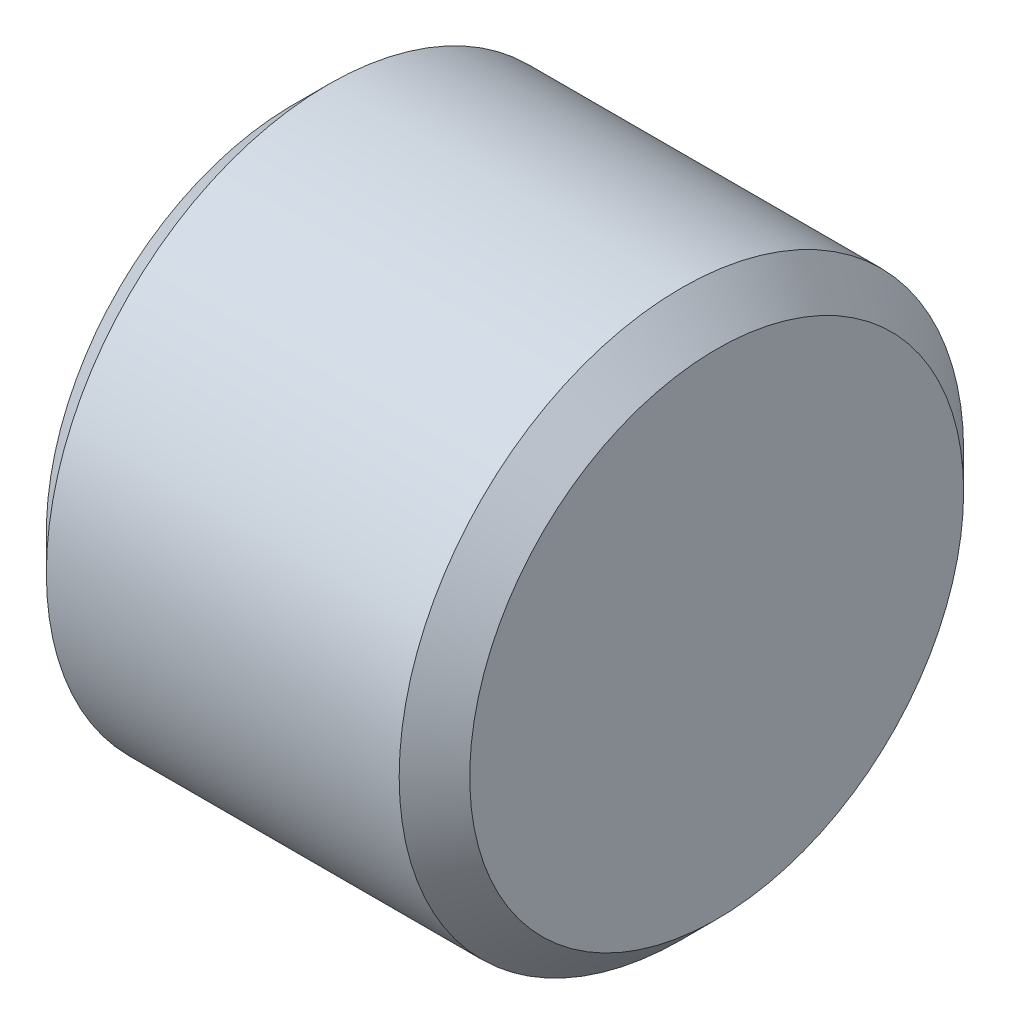
ISO-10303-21;
HEADER;
FILE_DESCRIPTION(('STEP AP214'),'2;1');
FILE_NAME('part.step','',(''),(''),'','','');
FILE_SCHEMA(('AUTOMOTIVE_DESIGN { 1 0 10303 214 1 1 1 1 }'));
ENDSEC;
DATA;
#1=APPLICATION_CONTEXT('core data for automotive mechanical design processes');
#2=APPLICATION_PROTOCOL_DEFINITION('international standard','automotive_design',2000,#1);
#3=PRODUCT_CONTEXT('',#1,'mechanical');
#4=PRODUCT('Part','Part','',(#3));
#5=PRODUCT_RELATED_PRODUCT_CATEGORY('part','',(#4));
#6=PRODUCT_DEFINITION_FORMATION('','',#4);
#7=PRODUCT_DEFINITION_CONTEXT('part definition',#1,'design');
#8=PRODUCT_DEFINITION('design','',#6,#7);
#9=PRODUCT_DEFINITION_SHAPE('','',#8);
#10=(LENGTH_UNIT() NAMED_UNIT(*) SI_UNIT(.MILLI.,.METRE.));
#11=(NAMED_UNIT(*) PLANE_ANGLE_UNIT() SI_UNIT($,.RADIAN.));
#12=(NAMED_UNIT(*) SI_UNIT($,.STERADIAN.) SOLID_ANGLE_UNIT());
#13=UNCERTAINTY_MEASURE_WITH_UNIT(LENGTH_MEASURE(1.E-05),#10,'distance_accuracy_value','');
#14=(GEOMETRIC_REPRESENTATION_CONTEXT(3) GLOBAL_UNCERTAINTY_ASSIGNED_CONTEXT((#13)) GLOBAL_UNIT_ASSIGNED_CONTEXT((#10,
#11,#12)) REPRESENTATION_CONTEXT('',''));
#15=CARTESIAN_POINT('',(0.,0.,0.));
#16=DIRECTION('',(0.,0.,1.));
#17=DIRECTION('',(1.,0.,0.));
#18=AXIS2_PLACEMENT_3D('',#15,#16,#17);
#19=CARTESIAN_POINT('',(6.,0.,0.));
#20=DIRECTION('',(-1.,0.,0.));
#21=DIRECTION('',(0.,0.,1.));
#22=AXIS2_PLACEMENT_3D('',#19,#20,#21);
#23=CYLINDRICAL_SURFACE('',#22,4.);
#24=CARTESIAN_POINT('',(0.500000000000001,0.,0.));
#25=DIRECTION('',(1.,0.,0.));
#26=DIRECTION('',(0.,0.,-1.));
#27=AXIS2_PLACEMENT_3D('',#24,#25,#26);
#28=CIRCLE('',#27,4.);
#29=CARTESIAN_POINT('',(0.500000000000001,0.,-4.));
#30=VERTEX_POINT('',#29);
#31=EDGE_CURVE('E45',#30,#30,#28,.T.);
#32=ORIENTED_EDGE('',*,*,#31,.T.);
#33=EDGE_LOOP('',(#32));
#34=FACE_BOUND('',#33,.T.);
#35=CARTESIAN_POINT('',(5.5,0.,0.));
#36=DIRECTION('',(1.,0.,0.));
#37=DIRECTION('',(0.,0.,-1.));
#38=AXIS2_PLACEMENT_3D('',#35,#36,#37);
#39=CIRCLE('',#38,4.);
#40=CARTESIAN_POINT('',(5.5,0.,-4.));
#41=VERTEX_POINT('',#40);
#42=EDGE_CURVE('E49',#41,#41,#39,.F.);
#43=ORIENTED_EDGE('',*,*,#42,.T.);
#44=EDGE_LOOP('',(#43));
#45=FACE_BOUND('',#44,.T.);
#46=ADVANCED_FACE('F33',(#34,#45),#23,.T.);
#47=CARTESIAN_POINT('',(6.,0.,0.));
#48=DIRECTION('',(1.,0.,0.));
#49=DIRECTION('',(0.,0.,-1.));
#50=AXIS2_PLACEMENT_3D('',#47,#48,#49);
#51=PLANE('',#50);
#52=CARTESIAN_POINT('',(6.,0.,0.));
#53=DIRECTION('',(1.,0.,0.));
#54=DIRECTION('',(0.,0.,-1.));
#55=AXIS2_PLACEMENT_3D('',#52,#53,#54);
#56=CIRCLE('',#55,3.5);
#57=CARTESIAN_POINT('',(6.,0.,-3.5));
#58=VERTEX_POINT('',#57);
#59=EDGE_CURVE('E10',#58,#58,#56,.T.);
#60=ORIENTED_EDGE('',*,*,#59,.T.);
#61=EDGE_LOOP('',(#60));
#62=FACE_BOUND('',#61,.T.);
#63=ADVANCED_FACE('F65',(#62),#51,.T.);
#64=CARTESIAN_POINT('',(0.,0.,0.));
#65=DIRECTION('',(1.,0.,0.));
#66=DIRECTION('',(0.,0.,-1.));
#67=AXIS2_PLACEMENT_3D('',#64,#65,#66);
#68=PLANE('',#67);
#69=CARTESIAN_POINT('',(0.,0.,0.));
#70=DIRECTION('',(1.,0.,0.));
#71=DIRECTION('',(0.,0.,-1.));
#72=AXIS2_PLACEMENT_3D('',#69,#70,#71);
#73=CIRCLE('',#72,3.5);
#74=CARTESIAN_POINT('',(0.,0.,-3.5));
#75=VERTEX_POINT('',#74);
#76=EDGE_CURVE('E41',#75,#75,#73,.F.);
#77=ORIENTED_EDGE('',*,*,#76,.T.);
#78=EDGE_LOOP('',(#77));
#79=FACE_BOUND('',#78,.T.);
#80=ADVANCED_FACE('F62',(#79),#68,.F.);
#81=CARTESIAN_POINT('',(0.500000000000001,0.,0.));
#82=DIRECTION('',(1.,0.,0.));
#83=DIRECTION('',(0.,0.,-1.));
#84=AXIS2_PLACEMENT_3D('',#81,#82,#83);
#85=CONICAL_SURFACE('',#84,4.,0.785398163397451);
#86=ORIENTED_EDGE('',*,*,#76,.F.);
#87=EDGE_LOOP('',(#86));
#88=FACE_BOUND('',#87,.T.);
#89=ORIENTED_EDGE('',*,*,#31,.F.);
#90=EDGE_LOOP('',(#89));
#91=FACE_BOUND('',#90,.T.);
#92=ADVANCED_FACE('F58',(#88,#91),#85,.T.);
#93=CARTESIAN_POINT('',(6.,0.,0.));
#94=DIRECTION('',(-1.,0.,0.));
#95=DIRECTION('',(0.,0.,1.));
#96=AXIS2_PLACEMENT_3D('',#93,#94,#95);
#97=CONICAL_SURFACE('',#96,3.5,0.785398163397447);
#98=ORIENTED_EDGE('',*,*,#42,.F.);
#99=EDGE_LOOP('',(#98));
#100=FACE_BOUND('',#99,.T.);
#101=ORIENTED_EDGE('',*,*,#59,.F.);
#102=EDGE_LOOP('',(#101));
#103=FACE_BOUND('',#102,.T.);
#104=ADVANCED_FACE('F36',(#100,#103),#97,.T.);
#105=CLOSED_SHELL('',(#46,#63,#80,#92,#104));
#106=MANIFOLD_SOLID_BREP('B2',#105);
#107=ADVANCED_BREP_SHAPE_REPRESENTATION('',(#18,#106),#14);
#108=SHAPE_DEFINITION_REPRESENTATION(#9,#107);
ENDSEC;
END-ISO-10303-21;
